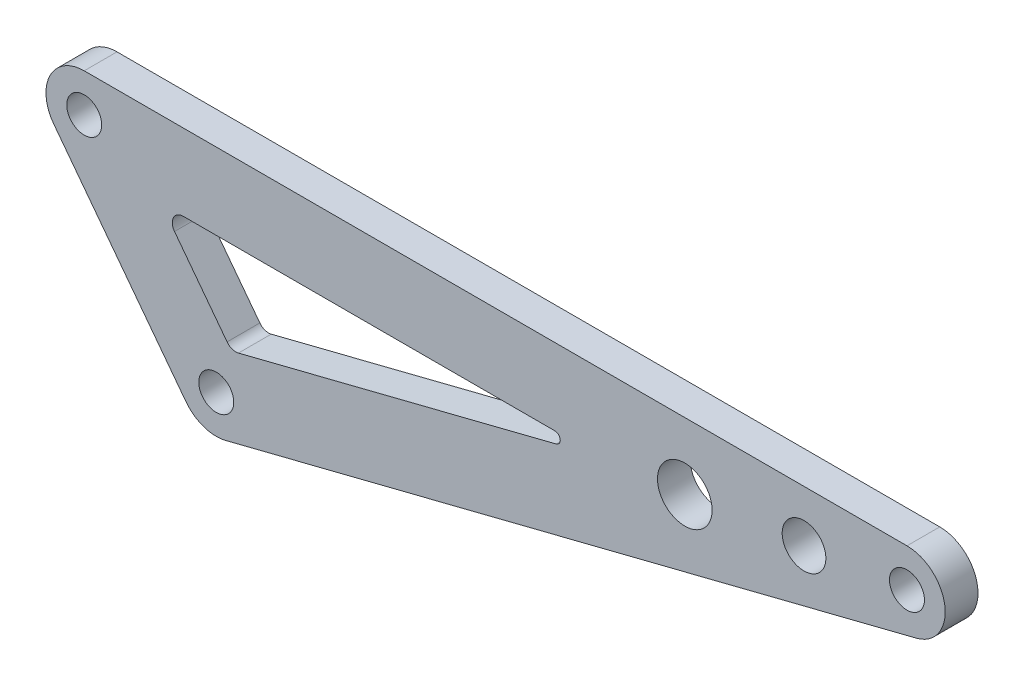
ISO-10303-21;
HEADER;
FILE_DESCRIPTION(('STEP AP214'),'2;1');
FILE_NAME('part.step','',(''),(''),'','','');
FILE_SCHEMA(('AUTOMOTIVE_DESIGN { 1 0 10303 214 1 1 1 1 }'));
ENDSEC;
DATA;
#1=APPLICATION_CONTEXT('core data for automotive mechanical design processes');
#2=APPLICATION_PROTOCOL_DEFINITION('international standard','automotive_design',2000,#1);
#3=PRODUCT_CONTEXT('',#1,'mechanical');
#4=PRODUCT('Part','Part','',(#3));
#5=PRODUCT_RELATED_PRODUCT_CATEGORY('part','',(#4));
#6=PRODUCT_DEFINITION_FORMATION('','',#4);
#7=PRODUCT_DEFINITION_CONTEXT('part definition',#1,'design');
#8=PRODUCT_DEFINITION('design','',#6,#7);
#9=PRODUCT_DEFINITION_SHAPE('','',#8);
#10=(LENGTH_UNIT() NAMED_UNIT(*) SI_UNIT(.MILLI.,.METRE.));
#11=(NAMED_UNIT(*) PLANE_ANGLE_UNIT() SI_UNIT($,.RADIAN.));
#12=(NAMED_UNIT(*) SI_UNIT($,.STERADIAN.) SOLID_ANGLE_UNIT());
#13=UNCERTAINTY_MEASURE_WITH_UNIT(LENGTH_MEASURE(1.E-05),#10,'distance_accuracy_value','');
#14=(GEOMETRIC_REPRESENTATION_CONTEXT(3) GLOBAL_UNCERTAINTY_ASSIGNED_CONTEXT((#13)) GLOBAL_UNIT_ASSIGNED_CONTEXT((#10,
#11,#12)) REPRESENTATION_CONTEXT('',''));
#15=CARTESIAN_POINT('',(0.,0.,0.));
#16=DIRECTION('',(0.,0.,1.));
#17=DIRECTION('',(1.,0.,0.));
#18=AXIS2_PLACEMENT_3D('',#15,#16,#17);
#19=CARTESIAN_POINT('',(-47.8080904147461,-36.2544685645158,3.));
#20=DIRECTION('',(0.,0.,1.));
#21=DIRECTION('',(1.,0.,0.));
#22=AXIS2_PLACEMENT_3D('',#19,#20,#21);
#23=PLANE('',#22);
#24=CARTESIAN_POINT('',(7.15902101702035,-38.8583959127669,3.));
#25=DIRECTION('',(0.,0.,1.));
#26=DIRECTION('',(1.,0.,0.));
#27=AXIS2_PLACEMENT_3D('',#24,#25,#26);
#28=CIRCLE('',#27,2.5);
#29=CARTESIAN_POINT('',(9.65902101702035,-38.8583959127669,3.));
#30=VERTEX_POINT('',#29);
#31=EDGE_CURVE('E422',#30,#30,#28,.T.);
#32=ORIENTED_EDGE('',*,*,#31,.F.);
#33=EDGE_LOOP('',(#32));
#34=FACE_BOUND('',#33,.T.);
#35=CARTESIAN_POINT('',(18.06992154166,-37.4611666039492,3.));
#36=DIRECTION('',(0.,0.,1.));
#37=DIRECTION('',(1.,0.,0.));
#38=AXIS2_PLACEMENT_3D('',#35,#36,#37);
#39=CIRCLE('',#38,2.00000000000001);
#40=CARTESIAN_POINT('',(20.06992154166,-37.4611666039492,3.));
#41=VERTEX_POINT('',#40);
#42=EDGE_CURVE('E428',#41,#41,#39,.T.);
#43=ORIENTED_EDGE('',*,*,#42,.F.);
#44=EDGE_LOOP('',(#43));
#45=FACE_BOUND('',#44,.T.);
#46=CARTESIAN_POINT('',(27.4929719947578,-36.2544685645158,3.));
#47=DIRECTION('',(0.,0.,1.));
#48=DIRECTION('',(1.,0.,0.));
#49=AXIS2_PLACEMENT_3D('',#46,#47,#48);
#50=CIRCLE('',#49,1.60000000000001);
#51=CARTESIAN_POINT('',(29.0929719947578,-36.2544685645158,3.));
#52=VERTEX_POINT('',#51);
#53=EDGE_CURVE('E439',#52,#52,#50,.T.);
#54=ORIENTED_EDGE('',*,*,#53,.F.);
#55=EDGE_LOOP('',(#54));
#56=FACE_BOUND('',#55,.T.);
#57=DIRECTION('',(0.969664330180601,0.244440354228606,0.));
#58=VECTOR('',#57,1.);
#59=CARTESIAN_POINT('',(-34.3335705168291,-48.2306768159829,3.));
#60=LINE('',#59,#58);
#61=CARTESIAN_POINT('',(-33.6920738645781,-48.068963464226,3.));
#62=VERTEX_POINT('',#61);
#63=CARTESIAN_POINT('',(-4.61621800418302,-40.7393007296061,3.));
#64=VERTEX_POINT('',#63);
#65=EDGE_CURVE('E197',#62,#64,#60,.T.);
#66=ORIENTED_EDGE('',*,*,#65,.F.);
#67=CARTESIAN_POINT('',(-33.9365142188067,-47.0992991340453,3.));
#68=DIRECTION('',(0.,0.,1.));
#69=DIRECTION('',(1.,0.,0.));
#70=AXIS2_PLACEMENT_3D('',#67,#68,#69);
#71=CIRCLE('',#70,1.);
#72=CARTESIAN_POINT('',(-34.7333157257191,-47.7035402767873,3.));
#73=VERTEX_POINT('',#72);
#74=EDGE_CURVE('E175',#62,#73,#71,.F.);
#75=ORIENTED_EDGE('',*,*,#74,.T.);
#76=DIRECTION('',(0.60424114274193,-0.796801506912435,0.));
#77=VECTOR('',#76,1.);
#78=CARTESIAN_POINT('',(-40.7613617741917,-39.7544685645158,3.));
#79=LINE('',#78,#77);
#80=CARTESIAN_POINT('',(-39.5448122409457,-41.3587097072577,3.));
#81=VERTEX_POINT('',#80);
#82=EDGE_CURVE('E201',#81,#73,#79,.T.);
#83=ORIENTED_EDGE('',*,*,#82,.F.);
#84=CARTESIAN_POINT('',(-38.7480107340333,-40.7544685645158,3.));
#85=DIRECTION('',(0.,0.,1.));
#86=DIRECTION('',(1.,0.,0.));
#87=AXIS2_PLACEMENT_3D('',#84,#85,#86);
#88=CIRCLE('',#87,1.);
#89=CARTESIAN_POINT('',(-38.7480107340333,-39.7544685645158,3.));
#90=VERTEX_POINT('',#89);
#91=EDGE_CURVE('E11',#81,#90,#88,.F.);
#92=ORIENTED_EDGE('',*,*,#91,.T.);
#93=DIRECTION('',(-1.,0.,0.));
#94=VECTOR('',#93,1.);
#95=CARTESIAN_POINT('',(-40.7613617741917,-39.7544685645158,3.));
#96=LINE('',#95,#94);
#97=CARTESIAN_POINT('',(-4.73843818129732,-39.7544685645158,3.));
#98=VERTEX_POINT('',#97);
#99=EDGE_CURVE('E195',#98,#90,#96,.T.);
#100=ORIENTED_EDGE('',*,*,#99,.F.);
#101=CARTESIAN_POINT('',(-4.73843818129732,-40.2544685645158,3.));
#102=DIRECTION('',(0.,0.,1.));
#103=DIRECTION('',(1.,0.,0.));
#104=AXIS2_PLACEMENT_3D('',#101,#102,#103);
#105=CIRCLE('',#104,0.5);
#106=EDGE_CURVE('E161',#98,#64,#105,.F.);
#107=ORIENTED_EDGE('',*,*,#106,.T.);
#108=EDGE_LOOP('',(#66,#75,#83,#92,#100,#107));
#109=FACE_BOUND('',#108,.T.);
#110=CARTESIAN_POINT('',(-47.8080904147461,-36.2544685645158,3.));
#111=DIRECTION('',(0.,0.,1.));
#112=DIRECTION('',(1.,0.,0.));
#113=AXIS2_PLACEMENT_3D('',#110,#111,#112);
#114=CIRCLE('',#113,3.5);
#115=CARTESIAN_POINT('',(-47.8080904147461,-32.7544685645158,3.));
#116=VERTEX_POINT('',#115);
#117=CARTESIAN_POINT('',(-50.5968956889396,-38.3693125641125,3.));
#118=VERTEX_POINT('',#117);
#119=EDGE_CURVE('E135',#116,#118,#114,.T.);
#120=ORIENTED_EDGE('',*,*,#119,.T.);
#121=DIRECTION('',(0.60424114274193,-0.796801506912435,0.));
#122=VECTOR('',#121,1.);
#123=CARTESIAN_POINT('',(-50.5968956889396,-38.3693125641125,3.));
#124=LINE('',#123,#122);
#125=CARTESIAN_POINT('',(-38.512072834101,-54.3053427023612,3.));
#126=VERTEX_POINT('',#125);
#127=EDGE_CURVE('E124',#118,#126,#124,.T.);
#128=ORIENTED_EDGE('',*,*,#127,.T.);
#129=CARTESIAN_POINT('',(-35.7232675599075,-52.1904987027645,3.));
#130=DIRECTION('',(0.,0.,1.));
#131=DIRECTION('',(1.,0.,0.));
#132=AXIS2_PLACEMENT_3D('',#129,#130,#131);
#133=CIRCLE('',#132,3.5);
#134=CARTESIAN_POINT('',(-34.8677263201074,-55.5843238583966,3.));
#135=VERTEX_POINT('',#134);
#136=EDGE_CURVE('E134',#126,#135,#133,.T.);
#137=ORIENTED_EDGE('',*,*,#136,.T.);
#138=DIRECTION('',(0.969664330180601,0.244440354228606,0.));
#139=VECTOR('',#138,1.);
#140=CARTESIAN_POINT('',(-34.8677263201074,-55.5843238583966,3.));
#141=LINE('',#140,#139);
#142=CARTESIAN_POINT('',(28.3485132345579,-39.6482937201479,3.));
#143=VERTEX_POINT('',#142);
#144=EDGE_CURVE('E208',#135,#143,#141,.T.);
#145=ORIENTED_EDGE('',*,*,#144,.T.);
#146=CARTESIAN_POINT('',(27.4929719947578,-36.2544685645158,3.));
#147=DIRECTION('',(0.,0.,1.));
#148=DIRECTION('',(-1.,0.,0.));
#149=AXIS2_PLACEMENT_3D('',#146,#147,#148);
#150=CIRCLE('',#149,3.5);
#151=CARTESIAN_POINT('',(27.4929719947578,-32.7544685645158,3.));
#152=VERTEX_POINT('',#151);
#153=EDGE_CURVE('E210',#143,#152,#150,.T.);
#154=ORIENTED_EDGE('',*,*,#153,.T.);
#155=DIRECTION('',(-1.,0.,0.));
#156=VECTOR('',#155,1.);
#157=CARTESIAN_POINT('',(-47.8080904147461,-32.7544685645158,3.));
#158=LINE('',#157,#156);
#159=EDGE_CURVE('E140',#152,#116,#158,.T.);
#160=ORIENTED_EDGE('',*,*,#159,.T.);
#161=EDGE_LOOP('',(#120,#128,#137,#145,#154,#160));
#162=FACE_BOUND('',#161,.T.);
#163=CARTESIAN_POINT('',(-47.8080904147461,-36.2544685645158,3.));
#164=DIRECTION('',(0.,0.,1.));
#165=DIRECTION('',(1.,0.,0.));
#166=AXIS2_PLACEMENT_3D('',#163,#164,#165);
#167=CIRCLE('',#166,1.6);
#168=CARTESIAN_POINT('',(-46.2080904147461,-36.2544685645158,3.));
#169=VERTEX_POINT('',#168);
#170=EDGE_CURVE('E190',#169,#169,#167,.T.);
#171=ORIENTED_EDGE('',*,*,#170,.F.);
#172=EDGE_LOOP('',(#171));
#173=FACE_BOUND('',#172,.T.);
#174=CARTESIAN_POINT('',(-35.7232675599075,-52.1904987027645,3.));
#175=DIRECTION('',(0.,0.,1.));
#176=DIRECTION('',(1.,0.,0.));
#177=AXIS2_PLACEMENT_3D('',#174,#175,#176);
#178=CIRCLE('',#177,1.60000000000001);
#179=CARTESIAN_POINT('',(-34.1232675599075,-52.1904987027645,3.));
#180=VERTEX_POINT('',#179);
#181=EDGE_CURVE('E433',#180,#180,#178,.T.);
#182=ORIENTED_EDGE('',*,*,#181,.F.);
#183=EDGE_LOOP('',(#182));
#184=FACE_BOUND('',#183,.T.);
#185=ADVANCED_FACE('F35',(#34,#45,#56,#109,#162,#173,#184),#23,.T.);
#186=CARTESIAN_POINT('',(-47.8080904147461,-36.2544685645158,0.));
#187=DIRECTION('',(0.,0.,1.));
#188=DIRECTION('',(1.,0.,0.));
#189=AXIS2_PLACEMENT_3D('',#186,#187,#188);
#190=PLANE('',#189);
#191=CARTESIAN_POINT('',(7.15902101702035,-38.8583959127669,0.));
#192=DIRECTION('',(0.,0.,1.));
#193=DIRECTION('',(1.,0.,0.));
#194=AXIS2_PLACEMENT_3D('',#191,#192,#193);
#195=CIRCLE('',#194,2.5);
#196=CARTESIAN_POINT('',(9.65902101702035,-38.8583959127669,0.));
#197=VERTEX_POINT('',#196);
#198=EDGE_CURVE('E420',#197,#197,#195,.T.);
#199=ORIENTED_EDGE('',*,*,#198,.T.);
#200=EDGE_LOOP('',(#199));
#201=FACE_BOUND('',#200,.T.);
#202=CARTESIAN_POINT('',(18.06992154166,-37.4611666039492,0.));
#203=DIRECTION('',(0.,0.,1.));
#204=DIRECTION('',(1.,0.,0.));
#205=AXIS2_PLACEMENT_3D('',#202,#203,#204);
#206=CIRCLE('',#205,2.00000000000001);
#207=CARTESIAN_POINT('',(20.06992154166,-37.4611666039492,0.));
#208=VERTEX_POINT('',#207);
#209=EDGE_CURVE('E423',#208,#208,#206,.T.);
#210=ORIENTED_EDGE('',*,*,#209,.T.);
#211=EDGE_LOOP('',(#210));
#212=FACE_BOUND('',#211,.T.);
#213=CARTESIAN_POINT('',(-47.8080904147461,-36.2544685645158,0.));
#214=DIRECTION('',(0.,0.,1.));
#215=DIRECTION('',(1.,0.,0.));
#216=AXIS2_PLACEMENT_3D('',#213,#214,#215);
#217=CIRCLE('',#216,3.5);
#218=CARTESIAN_POINT('',(-47.8080904147461,-32.7544685645158,0.));
#219=VERTEX_POINT('',#218);
#220=CARTESIAN_POINT('',(-50.5968956889396,-38.3693125641125,0.));
#221=VERTEX_POINT('',#220);
#222=EDGE_CURVE('E148',#219,#221,#217,.T.);
#223=ORIENTED_EDGE('',*,*,#222,.F.);
#224=DIRECTION('',(-1.,0.,0.));
#225=VECTOR('',#224,1.);
#226=CARTESIAN_POINT('',(-47.8080904147461,-32.7544685645158,0.));
#227=LINE('',#226,#225);
#228=CARTESIAN_POINT('',(27.4929719947578,-32.7544685645158,0.));
#229=VERTEX_POINT('',#228);
#230=EDGE_CURVE('E144',#229,#219,#227,.T.);
#231=ORIENTED_EDGE('',*,*,#230,.F.);
#232=CARTESIAN_POINT('',(27.4929719947578,-36.2544685645158,0.));
#233=DIRECTION('',(0.,0.,1.));
#234=DIRECTION('',(-1.,0.,0.));
#235=AXIS2_PLACEMENT_3D('',#232,#233,#234);
#236=CIRCLE('',#235,3.5);
#237=CARTESIAN_POINT('',(28.3485132345579,-39.6482937201479,0.));
#238=VERTEX_POINT('',#237);
#239=EDGE_CURVE('E219',#238,#229,#236,.T.);
#240=ORIENTED_EDGE('',*,*,#239,.F.);
#241=DIRECTION('',(0.969664330180601,0.244440354228606,0.));
#242=VECTOR('',#241,1.);
#243=CARTESIAN_POINT('',(-34.8677263201074,-55.5843238583966,0.));
#244=LINE('',#243,#242);
#245=CARTESIAN_POINT('',(-34.8677263201074,-55.5843238583966,0.));
#246=VERTEX_POINT('',#245);
#247=EDGE_CURVE('E217',#246,#238,#244,.T.);
#248=ORIENTED_EDGE('',*,*,#247,.F.);
#249=CARTESIAN_POINT('',(-35.7232675599075,-52.1904987027645,0.));
#250=DIRECTION('',(0.,0.,1.));
#251=DIRECTION('',(1.,0.,0.));
#252=AXIS2_PLACEMENT_3D('',#249,#250,#251);
#253=CIRCLE('',#252,3.5);
#254=CARTESIAN_POINT('',(-38.512072834101,-54.3053427023612,0.));
#255=VERTEX_POINT('',#254);
#256=EDGE_CURVE('E215',#255,#246,#253,.T.);
#257=ORIENTED_EDGE('',*,*,#256,.F.);
#258=DIRECTION('',(0.60424114274193,-0.796801506912435,0.));
#259=VECTOR('',#258,1.);
#260=CARTESIAN_POINT('',(-50.5968956889396,-38.3693125641125,0.));
#261=LINE('',#260,#259);
#262=EDGE_CURVE('E199',#221,#255,#261,.T.);
#263=ORIENTED_EDGE('',*,*,#262,.F.);
#264=EDGE_LOOP('',(#223,#231,#240,#248,#257,#263));
#265=FACE_BOUND('',#264,.T.);
#266=DIRECTION('',(-1.,0.,0.));
#267=VECTOR('',#266,1.);
#268=CARTESIAN_POINT('',(-40.7613617741917,-39.7544685645158,0.));
#269=LINE('',#268,#267);
#270=CARTESIAN_POINT('',(-4.73843818129732,-39.7544685645158,0.));
#271=VERTEX_POINT('',#270);
#272=CARTESIAN_POINT('',(-38.7480107340333,-39.7544685645158,0.));
#273=VERTEX_POINT('',#272);
#274=EDGE_CURVE('E184',#271,#273,#269,.T.);
#275=ORIENTED_EDGE('',*,*,#274,.T.);
#276=CARTESIAN_POINT('',(-38.7480107340333,-40.7544685645158,0.));
#277=DIRECTION('',(0.,0.,1.));
#278=DIRECTION('',(1.,0.,0.));
#279=AXIS2_PLACEMENT_3D('',#276,#277,#278);
#280=CIRCLE('',#279,1.);
#281=CARTESIAN_POINT('',(-39.5448122409457,-41.3587097072577,0.));
#282=VERTEX_POINT('',#281);
#283=EDGE_CURVE('E43',#273,#282,#280,.T.);
#284=ORIENTED_EDGE('',*,*,#283,.T.);
#285=DIRECTION('',(0.60424114274193,-0.796801506912435,0.));
#286=VECTOR('',#285,1.);
#287=CARTESIAN_POINT('',(-40.7613617741917,-39.7544685645158,0.));
#288=LINE('',#287,#286);
#289=CARTESIAN_POINT('',(-34.7333157257191,-47.7035402767873,0.));
#290=VERTEX_POINT('',#289);
#291=EDGE_CURVE('E182',#282,#290,#288,.T.);
#292=ORIENTED_EDGE('',*,*,#291,.T.);
#293=CARTESIAN_POINT('',(-33.9365142188067,-47.0992991340453,0.));
#294=DIRECTION('',(0.,0.,1.));
#295=DIRECTION('',(1.,0.,0.));
#296=AXIS2_PLACEMENT_3D('',#293,#294,#295);
#297=CIRCLE('',#296,1.);
#298=CARTESIAN_POINT('',(-33.6920738645781,-48.068963464226,0.));
#299=VERTEX_POINT('',#298);
#300=EDGE_CURVE('E173',#290,#299,#297,.T.);
#301=ORIENTED_EDGE('',*,*,#300,.T.);
#302=DIRECTION('',(0.969664330180601,0.244440354228606,0.));
#303=VECTOR('',#302,1.);
#304=CARTESIAN_POINT('',(-34.3335705168291,-48.2306768159829,0.));
#305=LINE('',#304,#303);
#306=CARTESIAN_POINT('',(-4.61621800418302,-40.7393007296061,0.));
#307=VERTEX_POINT('',#306);
#308=EDGE_CURVE('E189',#299,#307,#305,.T.);
#309=ORIENTED_EDGE('',*,*,#308,.T.);
#310=CARTESIAN_POINT('',(-4.73843818129732,-40.2544685645158,0.));
#311=DIRECTION('',(0.,0.,1.));
#312=DIRECTION('',(1.,0.,0.));
#313=AXIS2_PLACEMENT_3D('',#310,#311,#312);
#314=CIRCLE('',#313,0.5);
#315=EDGE_CURVE('E159',#307,#271,#314,.T.);
#316=ORIENTED_EDGE('',*,*,#315,.T.);
#317=EDGE_LOOP('',(#275,#284,#292,#301,#309,#316));
#318=FACE_BOUND('',#317,.T.);
#319=CARTESIAN_POINT('',(-47.8080904147461,-36.2544685645158,0.));
#320=DIRECTION('',(0.,0.,1.));
#321=DIRECTION('',(1.,0.,0.));
#322=AXIS2_PLACEMENT_3D('',#319,#320,#321);
#323=CIRCLE('',#322,1.6);
#324=CARTESIAN_POINT('',(-46.2080904147461,-36.2544685645158,0.));
#325=VERTEX_POINT('',#324);
#326=EDGE_CURVE('E442',#325,#325,#323,.T.);
#327=ORIENTED_EDGE('',*,*,#326,.T.);
#328=EDGE_LOOP('',(#327));
#329=FACE_BOUND('',#328,.T.);
#330=CARTESIAN_POINT('',(27.4929719947578,-36.2544685645158,0.));
#331=DIRECTION('',(0.,0.,1.));
#332=DIRECTION('',(1.,0.,0.));
#333=AXIS2_PLACEMENT_3D('',#330,#331,#332);
#334=CIRCLE('',#333,1.60000000000001);
#335=CARTESIAN_POINT('',(29.0929719947578,-36.2544685645158,0.));
#336=VERTEX_POINT('',#335);
#337=EDGE_CURVE('E436',#336,#336,#334,.T.);
#338=ORIENTED_EDGE('',*,*,#337,.T.);
#339=EDGE_LOOP('',(#338));
#340=FACE_BOUND('',#339,.T.);
#341=CARTESIAN_POINT('',(-35.7232675599075,-52.1904987027645,0.));
#342=DIRECTION('',(0.,0.,1.));
#343=DIRECTION('',(1.,0.,0.));
#344=AXIS2_PLACEMENT_3D('',#341,#342,#343);
#345=CIRCLE('',#344,1.60000000000001);
#346=CARTESIAN_POINT('',(-34.1232675599075,-52.1904987027645,0.));
#347=VERTEX_POINT('',#346);
#348=EDGE_CURVE('E425',#347,#347,#345,.T.);
#349=ORIENTED_EDGE('',*,*,#348,.T.);
#350=EDGE_LOOP('',(#349));
#351=FACE_BOUND('',#350,.T.);
#352=ADVANCED_FACE('F180',(#201,#212,#265,#318,#329,#340,#351),#190,.F.);
#353=CARTESIAN_POINT('',(-47.8080904147461,-36.2544685645158,3.));
#354=DIRECTION('',(0.,0.,-1.));
#355=DIRECTION('',(-1.,0.,0.));
#356=AXIS2_PLACEMENT_3D('',#353,#354,#355);
#357=CYLINDRICAL_SURFACE('',#356,3.5);
#358=ORIENTED_EDGE('',*,*,#222,.T.);
#359=DIRECTION('',(0.,0.,-1.));
#360=VECTOR('',#359,1.);
#361=CARTESIAN_POINT('',(-50.5968956889396,-38.3693125641125,3.));
#362=LINE('',#361,#360);
#363=EDGE_CURVE('E128',#118,#221,#362,.T.);
#364=ORIENTED_EDGE('',*,*,#363,.F.);
#365=ORIENTED_EDGE('',*,*,#119,.F.);
#366=DIRECTION('',(0.,0.,-1.));
#367=VECTOR('',#366,1.);
#368=CARTESIAN_POINT('',(-47.8080904147461,-32.7544685645158,3.));
#369=LINE('',#368,#367);
#370=EDGE_CURVE('E212',#116,#219,#369,.T.);
#371=ORIENTED_EDGE('',*,*,#370,.T.);
#372=EDGE_LOOP('',(#358,#364,#365,#371));
#373=FACE_BOUND('',#372,.T.);
#374=ADVANCED_FACE('F146',(#373),#357,.T.);
#375=CARTESIAN_POINT('',(-50.5968956889396,-38.3693125641125,3.));
#376=DIRECTION('',(0.796801506912435,0.60424114274193,0.));
#377=DIRECTION('',(-0.60424114274193,0.796801506912435,0.));
#378=AXIS2_PLACEMENT_3D('',#375,#376,#377);
#379=PLANE('',#378);
#380=ORIENTED_EDGE('',*,*,#262,.T.);
#381=DIRECTION('',(0.,0.,-1.));
#382=VECTOR('',#381,1.);
#383=CARTESIAN_POINT('',(-38.512072834101,-54.3053427023612,3.));
#384=LINE('',#383,#382);
#385=EDGE_CURVE('E131',#126,#255,#384,.T.);
#386=ORIENTED_EDGE('',*,*,#385,.F.);
#387=ORIENTED_EDGE('',*,*,#127,.F.);
#388=ORIENTED_EDGE('',*,*,#363,.T.);
#389=EDGE_LOOP('',(#380,#386,#387,#388));
#390=FACE_BOUND('',#389,.T.);
#391=ADVANCED_FACE('F126',(#390),#379,.F.);
#392=CARTESIAN_POINT('',(-35.7232675599075,-52.1904987027645,3.));
#393=DIRECTION('',(0.,0.,-1.));
#394=DIRECTION('',(-1.,0.,0.));
#395=AXIS2_PLACEMENT_3D('',#392,#393,#394);
#396=CYLINDRICAL_SURFACE('',#395,3.5);
#397=ORIENTED_EDGE('',*,*,#256,.T.);
#398=DIRECTION('',(0.,0.,-1.));
#399=VECTOR('',#398,1.);
#400=CARTESIAN_POINT('',(-34.8677263201074,-55.5843238583966,3.));
#401=LINE('',#400,#399);
#402=EDGE_CURVE('E154',#135,#246,#401,.T.);
#403=ORIENTED_EDGE('',*,*,#402,.F.);
#404=ORIENTED_EDGE('',*,*,#136,.F.);
#405=ORIENTED_EDGE('',*,*,#385,.T.);
#406=EDGE_LOOP('',(#397,#403,#404,#405));
#407=FACE_BOUND('',#406,.T.);
#408=ADVANCED_FACE('F246',(#407),#396,.T.);
#409=CARTESIAN_POINT('',(-34.8677263201074,-55.5843238583966,3.));
#410=DIRECTION('',(-0.244440354228606,0.969664330180601,0.));
#411=DIRECTION('',(-0.969664330180601,-0.244440354228606,0.));
#412=AXIS2_PLACEMENT_3D('',#409,#410,#411);
#413=PLANE('',#412);
#414=ORIENTED_EDGE('',*,*,#247,.T.);
#415=DIRECTION('',(0.,0.,-1.));
#416=VECTOR('',#415,1.);
#417=CARTESIAN_POINT('',(28.3485132345579,-39.6482937201479,3.));
#418=LINE('',#417,#416);
#419=EDGE_CURVE('E226',#143,#238,#418,.T.);
#420=ORIENTED_EDGE('',*,*,#419,.F.);
#421=ORIENTED_EDGE('',*,*,#144,.F.);
#422=ORIENTED_EDGE('',*,*,#402,.T.);
#423=EDGE_LOOP('',(#414,#420,#421,#422));
#424=FACE_BOUND('',#423,.T.);
#425=ADVANCED_FACE('F233',(#424),#413,.F.);
#426=CARTESIAN_POINT('',(27.4929719947578,-36.2544685645158,3.));
#427=DIRECTION('',(0.,0.,-1.));
#428=DIRECTION('',(-1.,0.,0.));
#429=AXIS2_PLACEMENT_3D('',#426,#427,#428);
#430=CYLINDRICAL_SURFACE('',#429,3.5);
#431=ORIENTED_EDGE('',*,*,#239,.T.);
#432=DIRECTION('',(0.,0.,-1.));
#433=VECTOR('',#432,1.);
#434=CARTESIAN_POINT('',(27.4929719947578,-32.7544685645158,3.));
#435=LINE('',#434,#433);
#436=EDGE_CURVE('E223',#152,#229,#435,.T.);
#437=ORIENTED_EDGE('',*,*,#436,.F.);
#438=ORIENTED_EDGE('',*,*,#153,.F.);
#439=ORIENTED_EDGE('',*,*,#419,.T.);
#440=EDGE_LOOP('',(#431,#437,#438,#439));
#441=FACE_BOUND('',#440,.T.);
#442=ADVANCED_FACE('F242',(#441),#430,.T.);
#443=CARTESIAN_POINT('',(-47.8080904147461,-32.7544685645158,3.));
#444=DIRECTION('',(0.,-1.,0.));
#445=DIRECTION('',(1.,0.,0.));
#446=AXIS2_PLACEMENT_3D('',#443,#444,#445);
#447=PLANE('',#446);
#448=ORIENTED_EDGE('',*,*,#230,.T.);
#449=ORIENTED_EDGE('',*,*,#370,.F.);
#450=ORIENTED_EDGE('',*,*,#159,.F.);
#451=ORIENTED_EDGE('',*,*,#436,.T.);
#452=EDGE_LOOP('',(#448,#449,#450,#451));
#453=FACE_BOUND('',#452,.T.);
#454=ADVANCED_FACE('F245',(#453),#447,.F.);
#455=CARTESIAN_POINT('',(-40.7613617741917,-39.7544685645158,3.));
#456=DIRECTION('',(0.796801506912435,0.60424114274193,0.));
#457=DIRECTION('',(-0.60424114274193,0.796801506912435,0.));
#458=AXIS2_PLACEMENT_3D('',#455,#456,#457);
#459=PLANE('',#458);
#460=ORIENTED_EDGE('',*,*,#82,.T.);
#461=DIRECTION('',(0.,0.,-1.));
#462=VECTOR('',#461,1.);
#463=CARTESIAN_POINT('',(-34.7333157257191,-47.7035402767873,0.));
#464=LINE('',#463,#462);
#465=EDGE_CURVE('E166',#73,#290,#464,.T.);
#466=ORIENTED_EDGE('',*,*,#465,.T.);
#467=ORIENTED_EDGE('',*,*,#291,.F.);
#468=DIRECTION('',(0.,0.,-1.));
#469=VECTOR('',#468,1.);
#470=CARTESIAN_POINT('',(-39.5448122409457,-41.3587097072577,3.));
#471=LINE('',#470,#469);
#472=EDGE_CURVE('E164',#282,#81,#471,.F.);
#473=ORIENTED_EDGE('',*,*,#472,.T.);
#474=EDGE_LOOP('',(#460,#466,#467,#473));
#475=FACE_BOUND('',#474,.T.);
#476=ADVANCED_FACE('F187',(#475),#459,.T.);
#477=CARTESIAN_POINT('',(-34.3335705168291,-48.2306768159829,3.));
#478=DIRECTION('',(-0.244440354228606,0.969664330180601,0.));
#479=DIRECTION('',(-0.969664330180601,-0.244440354228606,0.));
#480=AXIS2_PLACEMENT_3D('',#477,#478,#479);
#481=PLANE('',#480);
#482=ORIENTED_EDGE('',*,*,#308,.F.);
#483=DIRECTION('',(0.,0.,-1.));
#484=VECTOR('',#483,1.);
#485=CARTESIAN_POINT('',(-33.6920738645781,-48.068963464226,3.));
#486=LINE('',#485,#484);
#487=EDGE_CURVE('E169',#299,#62,#486,.F.);
#488=ORIENTED_EDGE('',*,*,#487,.T.);
#489=ORIENTED_EDGE('',*,*,#65,.T.);
#490=DIRECTION('',(0.,0.,-1.));
#491=VECTOR('',#490,1.);
#492=CARTESIAN_POINT('',(-4.61621800418301,-40.7393007296061,0.));
#493=LINE('',#492,#491);
#494=EDGE_CURVE('E149',#64,#307,#493,.T.);
#495=ORIENTED_EDGE('',*,*,#494,.T.);
#496=EDGE_LOOP('',(#482,#488,#489,#495));
#497=FACE_BOUND('',#496,.T.);
#498=ADVANCED_FACE('F286',(#497),#481,.T.);
#499=CARTESIAN_POINT('',(-40.7613617741917,-39.7544685645158,3.));
#500=DIRECTION('',(0.,-1.,0.));
#501=DIRECTION('',(0.,0.,-1.));
#502=AXIS2_PLACEMENT_3D('',#499,#500,#501);
#503=PLANE('',#502);
#504=ORIENTED_EDGE('',*,*,#99,.T.);
#505=DIRECTION('',(0.,0.,-1.));
#506=VECTOR('',#505,1.);
#507=CARTESIAN_POINT('',(-38.7480107340333,-39.7544685645158,0.));
#508=LINE('',#507,#506);
#509=EDGE_CURVE('E171',#90,#273,#508,.T.);
#510=ORIENTED_EDGE('',*,*,#509,.T.);
#511=ORIENTED_EDGE('',*,*,#274,.F.);
#512=DIRECTION('',(0.,0.,-1.));
#513=VECTOR('',#512,1.);
#514=CARTESIAN_POINT('',(-4.73843818129732,-39.7544685645158,3.));
#515=LINE('',#514,#513);
#516=EDGE_CURVE('E152',#271,#98,#515,.F.);
#517=ORIENTED_EDGE('',*,*,#516,.T.);
#518=EDGE_LOOP('',(#504,#510,#511,#517));
#519=FACE_BOUND('',#518,.T.);
#520=ADVANCED_FACE('F193',(#519),#503,.T.);
#521=CARTESIAN_POINT('',(-47.8080904147461,-36.2544685645158,3.));
#522=DIRECTION('',(0.,0.,-1.));
#523=DIRECTION('',(-1.,0.,0.));
#524=AXIS2_PLACEMENT_3D('',#521,#522,#523);
#525=CYLINDRICAL_SURFACE('',#524,1.6);
#526=ORIENTED_EDGE('',*,*,#170,.T.);
#527=EDGE_LOOP('',(#526));
#528=FACE_BOUND('',#527,.T.);
#529=ORIENTED_EDGE('',*,*,#326,.F.);
#530=EDGE_LOOP('',(#529));
#531=FACE_BOUND('',#530,.T.);
#532=ADVANCED_FACE('F299',(#528,#531),#525,.F.);
#533=CARTESIAN_POINT('',(27.4929719947578,-36.2544685645158,3.));
#534=DIRECTION('',(0.,0.,-1.));
#535=DIRECTION('',(-1.,0.,0.));
#536=AXIS2_PLACEMENT_3D('',#533,#534,#535);
#537=CYLINDRICAL_SURFACE('',#536,1.60000000000001);
#538=ORIENTED_EDGE('',*,*,#53,.T.);
#539=EDGE_LOOP('',(#538));
#540=FACE_BOUND('',#539,.T.);
#541=ORIENTED_EDGE('',*,*,#337,.F.);
#542=EDGE_LOOP('',(#541));
#543=FACE_BOUND('',#542,.T.);
#544=ADVANCED_FACE('F306',(#540,#543),#537,.F.);
#545=CARTESIAN_POINT('',(-35.7232675599075,-52.1904987027645,3.));
#546=DIRECTION('',(0.,0.,-1.));
#547=DIRECTION('',(-1.,0.,0.));
#548=AXIS2_PLACEMENT_3D('',#545,#546,#547);
#549=CYLINDRICAL_SURFACE('',#548,1.60000000000001);
#550=ORIENTED_EDGE('',*,*,#181,.T.);
#551=EDGE_LOOP('',(#550));
#552=FACE_BOUND('',#551,.T.);
#553=ORIENTED_EDGE('',*,*,#348,.F.);
#554=EDGE_LOOP('',(#553));
#555=FACE_BOUND('',#554,.T.);
#556=ADVANCED_FACE('F314',(#552,#555),#549,.F.);
#557=CARTESIAN_POINT('',(-4.73843818129732,-40.2544685645158,3.));
#558=DIRECTION('',(0.,0.,1.));
#559=DIRECTION('',(1.,0.,0.));
#560=AXIS2_PLACEMENT_3D('',#557,#558,#559);
#561=CYLINDRICAL_SURFACE('',#560,0.5);
#562=ORIENTED_EDGE('',*,*,#106,.F.);
#563=ORIENTED_EDGE('',*,*,#516,.F.);
#564=ORIENTED_EDGE('',*,*,#315,.F.);
#565=ORIENTED_EDGE('',*,*,#494,.F.);
#566=EDGE_LOOP('',(#562,#563,#564,#565));
#567=FACE_BOUND('',#566,.T.);
#568=ADVANCED_FACE('F322',(#567),#561,.F.);
#569=CARTESIAN_POINT('',(-33.9365142188067,-47.0992991340453,3.));
#570=DIRECTION('',(0.,0.,1.));
#571=DIRECTION('',(1.,0.,0.));
#572=AXIS2_PLACEMENT_3D('',#569,#570,#571);
#573=CYLINDRICAL_SURFACE('',#572,1.);
#574=ORIENTED_EDGE('',*,*,#74,.F.);
#575=ORIENTED_EDGE('',*,*,#487,.F.);
#576=ORIENTED_EDGE('',*,*,#300,.F.);
#577=ORIENTED_EDGE('',*,*,#465,.F.);
#578=EDGE_LOOP('',(#574,#575,#576,#577));
#579=FACE_BOUND('',#578,.T.);
#580=ADVANCED_FACE('F329',(#579),#573,.F.);
#581=CARTESIAN_POINT('',(-38.7480107340333,-40.7544685645158,3.));
#582=DIRECTION('',(0.,0.,1.));
#583=DIRECTION('',(1.,0.,0.));
#584=AXIS2_PLACEMENT_3D('',#581,#582,#583);
#585=CYLINDRICAL_SURFACE('',#584,1.);
#586=ORIENTED_EDGE('',*,*,#91,.F.);
#587=ORIENTED_EDGE('',*,*,#472,.F.);
#588=ORIENTED_EDGE('',*,*,#283,.F.);
#589=ORIENTED_EDGE('',*,*,#509,.F.);
#590=EDGE_LOOP('',(#586,#587,#588,#589));
#591=FACE_BOUND('',#590,.T.);
#592=ADVANCED_FACE('F37',(#591),#585,.F.);
#593=CARTESIAN_POINT('',(18.06992154166,-37.4611666039492,0.));
#594=DIRECTION('',(0.,0.,1.));
#595=DIRECTION('',(1.,0.,0.));
#596=AXIS2_PLACEMENT_3D('',#593,#594,#595);
#597=CYLINDRICAL_SURFACE('',#596,2.00000000000001);
#598=ORIENTED_EDGE('',*,*,#209,.F.);
#599=EDGE_LOOP('',(#598));
#600=FACE_BOUND('',#599,.T.);
#601=ORIENTED_EDGE('',*,*,#42,.T.);
#602=EDGE_LOOP('',(#601));
#603=FACE_BOUND('',#602,.T.);
#604=ADVANCED_FACE('F342',(#600,#603),#597,.F.);
#605=CARTESIAN_POINT('',(7.15902101702035,-38.8583959127669,0.));
#606=DIRECTION('',(0.,0.,1.));
#607=DIRECTION('',(1.,0.,0.));
#608=AXIS2_PLACEMENT_3D('',#605,#606,#607);
#609=CYLINDRICAL_SURFACE('',#608,2.5);
#610=ORIENTED_EDGE('',*,*,#198,.F.);
#611=EDGE_LOOP('',(#610));
#612=FACE_BOUND('',#611,.T.);
#613=ORIENTED_EDGE('',*,*,#31,.T.);
#614=EDGE_LOOP('',(#613));
#615=FACE_BOUND('',#614,.T.);
#616=ADVANCED_FACE('F348',(#612,#615),#609,.F.);
#617=CLOSED_SHELL('',(#185,#352,#374,#391,#408,#425,#442,#454,#476,#498,#520,#532,#544,#556,
#568,#580,#592,#604,#616));
#618=MANIFOLD_SOLID_BREP('B2',#617);
#619=ADVANCED_BREP_SHAPE_REPRESENTATION('',(#18,#618),#14);
#620=SHAPE_DEFINITION_REPRESENTATION(#9,#619);
ENDSEC;
END-ISO-10303-21;
